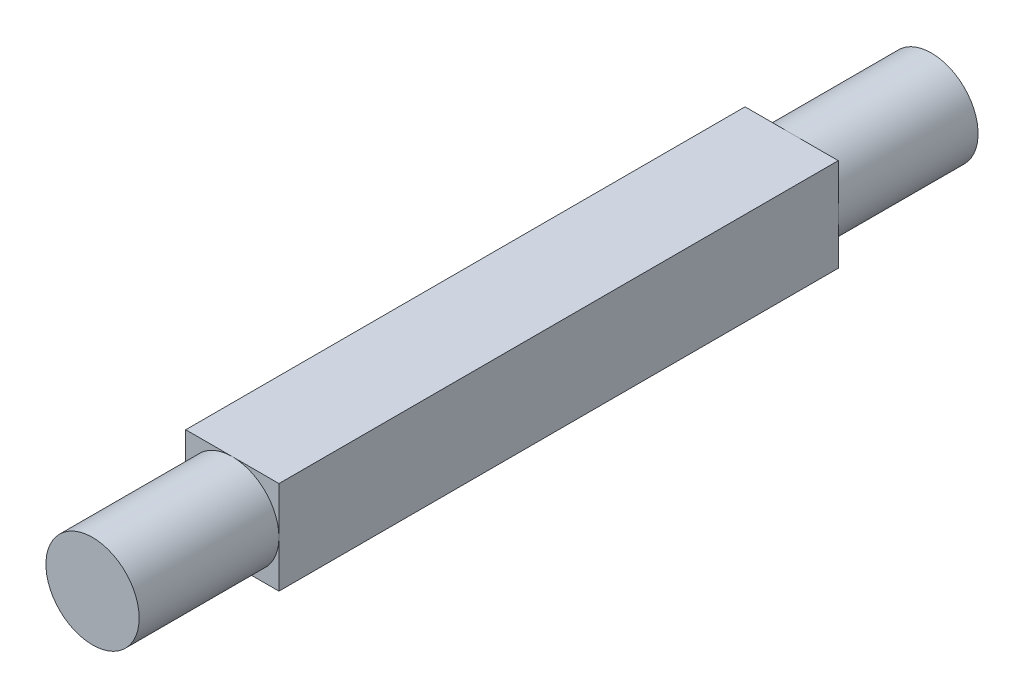
ISO-10303-21;
HEADER;
FILE_DESCRIPTION(('STEP AP214'),'2;1');
FILE_NAME('part.step','',(''),(''),'','','');
FILE_SCHEMA(('AUTOMOTIVE_DESIGN { 1 0 10303 214 1 1 1 1 }'));
ENDSEC;
DATA;
#1=APPLICATION_CONTEXT('core data for automotive mechanical design processes');
#2=APPLICATION_PROTOCOL_DEFINITION('international standard','automotive_design',2000,#1);
#3=PRODUCT_CONTEXT('',#1,'mechanical');
#4=PRODUCT('Part','Part','',(#3));
#5=PRODUCT_RELATED_PRODUCT_CATEGORY('part','',(#4));
#6=PRODUCT_DEFINITION_FORMATION('','',#4);
#7=PRODUCT_DEFINITION_CONTEXT('part definition',#1,'design');
#8=PRODUCT_DEFINITION('design','',#6,#7);
#9=PRODUCT_DEFINITION_SHAPE('','',#8);
#10=(LENGTH_UNIT() NAMED_UNIT(*) SI_UNIT(.MILLI.,.METRE.));
#11=(NAMED_UNIT(*) PLANE_ANGLE_UNIT() SI_UNIT($,.RADIAN.));
#12=(NAMED_UNIT(*) SI_UNIT($,.STERADIAN.) SOLID_ANGLE_UNIT());
#13=UNCERTAINTY_MEASURE_WITH_UNIT(LENGTH_MEASURE(1.E-05),#10,'distance_accuracy_value','');
#14=(GEOMETRIC_REPRESENTATION_CONTEXT(3) GLOBAL_UNCERTAINTY_ASSIGNED_CONTEXT((#13)) GLOBAL_UNIT_ASSIGNED_CONTEXT((#10,
#11,#12)) REPRESENTATION_CONTEXT('',''));
#15=CARTESIAN_POINT('',(0.,0.,0.));
#16=DIRECTION('',(0.,0.,1.));
#17=DIRECTION('',(1.,0.,0.));
#18=AXIS2_PLACEMENT_3D('',#15,#16,#17);
#19=CARTESIAN_POINT('',(0.,0.,0.));
#20=DIRECTION('',(0.,0.,1.));
#21=DIRECTION('',(1.,0.,0.));
#22=AXIS2_PLACEMENT_3D('',#19,#20,#21);
#23=PLANE('',#22);
#24=CARTESIAN_POINT('',(0.,0.,0.));
#25=DIRECTION('',(0.,0.,-1.));
#26=DIRECTION('',(-1.,0.,0.));
#27=AXIS2_PLACEMENT_3D('',#24,#25,#26);
#28=CIRCLE('',#27,1.);
#29=CARTESIAN_POINT('',(-1.,0.,0.));
#30=VERTEX_POINT('',#29);
#31=CARTESIAN_POINT('',(0.,1.,0.));
#32=VERTEX_POINT('',#31);
#33=EDGE_CURVE('E48',#30,#32,#28,.T.);
#34=ORIENTED_EDGE('',*,*,#33,.F.);
#35=DIRECTION('',(0.,-1.,0.));
#36=VECTOR('',#35,1.);
#37=CARTESIAN_POINT('',(-1.,-1.,0.));
#38=LINE('',#37,#36);
#39=CARTESIAN_POINT('',(-1.,1.,0.));
#40=VERTEX_POINT('',#39);
#41=EDGE_CURVE('E107',#40,#30,#38,.T.);
#42=ORIENTED_EDGE('',*,*,#41,.F.);
#43=DIRECTION('',(-1.,0.,0.));
#44=VECTOR('',#43,1.);
#45=CARTESIAN_POINT('',(1.,1.,0.));
#46=LINE('',#45,#44);
#47=EDGE_CURVE('E124',#32,#40,#46,.T.);
#48=ORIENTED_EDGE('',*,*,#47,.F.);
#49=EDGE_LOOP('',(#34,#42,#48));
#50=FACE_BOUND('',#49,.T.);
#51=ADVANCED_FACE('F37',(#50),#23,.F.);
#52=CARTESIAN_POINT('',(1.,0.,0.));
#53=VERTEX_POINT('',#52);
#54=EDGE_CURVE('E11',#32,#53,#28,.T.);
#55=ORIENTED_EDGE('',*,*,#54,.F.);
#56=CARTESIAN_POINT('',(1.,1.,0.));
#57=VERTEX_POINT('',#56);
#58=EDGE_CURVE('E160',#57,#32,#46,.T.);
#59=ORIENTED_EDGE('',*,*,#58,.F.);
#60=DIRECTION('',(0.,1.,0.));
#61=VECTOR('',#60,1.);
#62=CARTESIAN_POINT('',(1.,-1.,0.));
#63=LINE('',#62,#61);
#64=EDGE_CURVE('E156',#53,#57,#63,.T.);
#65=ORIENTED_EDGE('',*,*,#64,.F.);
#66=EDGE_LOOP('',(#55,#59,#65));
#67=FACE_BOUND('',#66,.T.);
#68=ADVANCED_FACE('F188',(#67),#23,.F.);
#69=CARTESIAN_POINT('',(0.,-1.,0.));
#70=VERTEX_POINT('',#69);
#71=EDGE_CURVE('E46',#53,#70,#28,.T.);
#72=ORIENTED_EDGE('',*,*,#71,.F.);
#73=CARTESIAN_POINT('',(1.,-1.,0.));
#74=VERTEX_POINT('',#73);
#75=EDGE_CURVE('E157',#74,#53,#63,.T.);
#76=ORIENTED_EDGE('',*,*,#75,.F.);
#77=DIRECTION('',(1.,0.,0.));
#78=VECTOR('',#77,1.);
#79=CARTESIAN_POINT('',(1.,-1.,0.));
#80=LINE('',#79,#78);
#81=EDGE_CURVE('E116',#70,#74,#80,.T.);
#82=ORIENTED_EDGE('',*,*,#81,.F.);
#83=EDGE_LOOP('',(#72,#76,#82));
#84=FACE_BOUND('',#83,.T.);
#85=ADVANCED_FACE('F190',(#84),#23,.F.);
#86=CARTESIAN_POINT('',(0.,0.,12.));
#87=DIRECTION('',(0.,0.,1.));
#88=DIRECTION('',(1.,0.,0.));
#89=AXIS2_PLACEMENT_3D('',#86,#87,#88);
#90=PLANE('',#89);
#91=CARTESIAN_POINT('',(0.,0.,12.));
#92=DIRECTION('',(0.,0.,1.));
#93=DIRECTION('',(1.,0.,0.));
#94=AXIS2_PLACEMENT_3D('',#91,#92,#93);
#95=CIRCLE('',#94,1.);
#96=CARTESIAN_POINT('',(1.,0.,12.));
#97=VERTEX_POINT('',#96);
#98=CARTESIAN_POINT('',(0.,1.,12.));
#99=VERTEX_POINT('',#98);
#100=EDGE_CURVE('E133',#97,#99,#95,.T.);
#101=ORIENTED_EDGE('',*,*,#100,.F.);
#102=DIRECTION('',(0.,1.,0.));
#103=VECTOR('',#102,1.);
#104=CARTESIAN_POINT('',(1.,-1.,12.));
#105=LINE('',#104,#103);
#106=CARTESIAN_POINT('',(1.,1.,12.));
#107=VERTEX_POINT('',#106);
#108=EDGE_CURVE('E148',#97,#107,#105,.T.);
#109=ORIENTED_EDGE('',*,*,#108,.T.);
#110=DIRECTION('',(-1.,0.,0.));
#111=VECTOR('',#110,1.);
#112=CARTESIAN_POINT('',(1.,1.,12.));
#113=LINE('',#112,#111);
#114=EDGE_CURVE('E152',#107,#99,#113,.T.);
#115=ORIENTED_EDGE('',*,*,#114,.T.);
#116=EDGE_LOOP('',(#101,#109,#115));
#117=FACE_BOUND('',#116,.T.);
#118=ADVANCED_FACE('F215',(#117),#90,.T.);
#119=CARTESIAN_POINT('',(-1.,0.,12.));
#120=VERTEX_POINT('',#119);
#121=EDGE_CURVE('E129',#99,#120,#95,.T.);
#122=ORIENTED_EDGE('',*,*,#121,.F.);
#123=CARTESIAN_POINT('',(-1.,1.,12.));
#124=VERTEX_POINT('',#123);
#125=EDGE_CURVE('E151',#99,#124,#113,.T.);
#126=ORIENTED_EDGE('',*,*,#125,.T.);
#127=DIRECTION('',(0.,-1.,0.));
#128=VECTOR('',#127,1.);
#129=CARTESIAN_POINT('',(-1.,-1.,12.));
#130=LINE('',#129,#128);
#131=EDGE_CURVE('E140',#124,#120,#130,.T.);
#132=ORIENTED_EDGE('',*,*,#131,.T.);
#133=EDGE_LOOP('',(#122,#126,#132));
#134=FACE_BOUND('',#133,.T.);
#135=ADVANCED_FACE('F180',(#134),#90,.T.);
#136=CARTESIAN_POINT('',(0.,-1.,12.));
#137=VERTEX_POINT('',#136);
#138=EDGE_CURVE('E131',#120,#137,#95,.T.);
#139=ORIENTED_EDGE('',*,*,#138,.F.);
#140=CARTESIAN_POINT('',(-1.,-1.,12.));
#141=VERTEX_POINT('',#140);
#142=EDGE_CURVE('E144',#120,#141,#130,.T.);
#143=ORIENTED_EDGE('',*,*,#142,.T.);
#144=DIRECTION('',(1.,0.,0.));
#145=VECTOR('',#144,1.);
#146=CARTESIAN_POINT('',(1.,-1.,12.));
#147=LINE('',#146,#145);
#148=EDGE_CURVE('E145',#141,#137,#147,.T.);
#149=ORIENTED_EDGE('',*,*,#148,.T.);
#150=EDGE_LOOP('',(#139,#143,#149));
#151=FACE_BOUND('',#150,.T.);
#152=ADVANCED_FACE('F178',(#151),#90,.T.);
#153=CARTESIAN_POINT('',(-1.,-1.,12.));
#154=DIRECTION('',(1.,0.,0.));
#155=DIRECTION('',(0.,0.,-1.));
#156=AXIS2_PLACEMENT_3D('',#153,#154,#155);
#157=PLANE('',#156);
#158=ORIENTED_EDGE('',*,*,#41,.T.);
#159=CARTESIAN_POINT('',(-1.,-1.,0.));
#160=VERTEX_POINT('',#159);
#161=EDGE_CURVE('E109',#30,#160,#38,.T.);
#162=ORIENTED_EDGE('',*,*,#161,.T.);
#163=DIRECTION('',(0.,0.,-1.));
#164=VECTOR('',#163,1.);
#165=CARTESIAN_POINT('',(-1.,-1.,12.));
#166=LINE('',#165,#164);
#167=EDGE_CURVE('E41',#141,#160,#166,.T.);
#168=ORIENTED_EDGE('',*,*,#167,.F.);
#169=ORIENTED_EDGE('',*,*,#142,.F.);
#170=ORIENTED_EDGE('',*,*,#131,.F.);
#171=DIRECTION('',(0.,0.,-1.));
#172=VECTOR('',#171,1.);
#173=CARTESIAN_POINT('',(-1.,1.,12.));
#174=LINE('',#173,#172);
#175=EDGE_CURVE('E112',#124,#40,#174,.T.);
#176=ORIENTED_EDGE('',*,*,#175,.T.);
#177=EDGE_LOOP('',(#158,#162,#168,#169,#170,#176));
#178=FACE_BOUND('',#177,.T.);
#179=ADVANCED_FACE('F39',(#178),#157,.F.);
#180=CARTESIAN_POINT('',(1.,-1.,12.));
#181=DIRECTION('',(0.,1.,0.));
#182=DIRECTION('',(-1.,0.,0.));
#183=AXIS2_PLACEMENT_3D('',#180,#181,#182);
#184=PLANE('',#183);
#185=EDGE_CURVE('E120',#160,#70,#80,.T.);
#186=ORIENTED_EDGE('',*,*,#185,.T.);
#187=ORIENTED_EDGE('',*,*,#81,.T.);
#188=DIRECTION('',(0.,0.,-1.));
#189=VECTOR('',#188,1.);
#190=CARTESIAN_POINT('',(1.,-1.,12.));
#191=LINE('',#190,#189);
#192=CARTESIAN_POINT('',(1.,-1.,12.));
#193=VERTEX_POINT('',#192);
#194=EDGE_CURVE('E165',#193,#74,#191,.T.);
#195=ORIENTED_EDGE('',*,*,#194,.F.);
#196=EDGE_CURVE('E143',#137,#193,#147,.T.);
#197=ORIENTED_EDGE('',*,*,#196,.F.);
#198=ORIENTED_EDGE('',*,*,#148,.F.);
#199=ORIENTED_EDGE('',*,*,#167,.T.);
#200=EDGE_LOOP('',(#186,#187,#195,#197,#198,#199));
#201=FACE_BOUND('',#200,.T.);
#202=ADVANCED_FACE('F191',(#201),#184,.F.);
#203=CARTESIAN_POINT('',(1.,-1.,12.));
#204=DIRECTION('',(-1.,0.,0.));
#205=DIRECTION('',(0.,0.,1.));
#206=AXIS2_PLACEMENT_3D('',#203,#204,#205);
#207=PLANE('',#206);
#208=ORIENTED_EDGE('',*,*,#75,.T.);
#209=ORIENTED_EDGE('',*,*,#64,.T.);
#210=DIRECTION('',(0.,0.,-1.));
#211=VECTOR('',#210,1.);
#212=CARTESIAN_POINT('',(1.,1.,12.));
#213=LINE('',#212,#211);
#214=EDGE_CURVE('E163',#107,#57,#213,.T.);
#215=ORIENTED_EDGE('',*,*,#214,.F.);
#216=ORIENTED_EDGE('',*,*,#108,.F.);
#217=EDGE_CURVE('E149',#193,#97,#105,.T.);
#218=ORIENTED_EDGE('',*,*,#217,.F.);
#219=ORIENTED_EDGE('',*,*,#194,.T.);
#220=EDGE_LOOP('',(#208,#209,#215,#216,#218,#219));
#221=FACE_BOUND('',#220,.T.);
#222=ADVANCED_FACE('F189',(#221),#207,.F.);
#223=CARTESIAN_POINT('',(1.,1.,12.));
#224=DIRECTION('',(0.,-1.,0.));
#225=DIRECTION('',(1.,0.,0.));
#226=AXIS2_PLACEMENT_3D('',#223,#224,#225);
#227=PLANE('',#226);
#228=ORIENTED_EDGE('',*,*,#58,.T.);
#229=ORIENTED_EDGE('',*,*,#47,.T.);
#230=ORIENTED_EDGE('',*,*,#175,.F.);
#231=ORIENTED_EDGE('',*,*,#125,.F.);
#232=ORIENTED_EDGE('',*,*,#114,.F.);
#233=ORIENTED_EDGE('',*,*,#214,.T.);
#234=EDGE_LOOP('',(#228,#229,#230,#231,#232,#233));
#235=FACE_BOUND('',#234,.T.);
#236=ADVANCED_FACE('F184',(#235),#227,.F.);
#237=EDGE_CURVE('E139',#137,#97,#95,.T.);
#238=ORIENTED_EDGE('',*,*,#237,.F.);
#239=ORIENTED_EDGE('',*,*,#196,.T.);
#240=ORIENTED_EDGE('',*,*,#217,.T.);
#241=EDGE_LOOP('',(#238,#239,#240));
#242=FACE_BOUND('',#241,.T.);
#243=ADVANCED_FACE('F206',(#242),#90,.T.);
#244=EDGE_CURVE('E55',#70,#30,#28,.T.);
#245=ORIENTED_EDGE('',*,*,#244,.F.);
#246=ORIENTED_EDGE('',*,*,#185,.F.);
#247=ORIENTED_EDGE('',*,*,#161,.F.);
#248=EDGE_LOOP('',(#245,#246,#247));
#249=FACE_BOUND('',#248,.T.);
#250=ADVANCED_FACE('F118',(#249),#23,.F.);
#251=CARTESIAN_POINT('',(0.,0.,15.));
#252=DIRECTION('',(0.,0.,-1.));
#253=DIRECTION('',(-1.,0.,0.));
#254=AXIS2_PLACEMENT_3D('',#251,#252,#253);
#255=CYLINDRICAL_SURFACE('',#254,1.);
#256=CARTESIAN_POINT('',(0.,0.,15.));
#257=DIRECTION('',(0.,0.,1.));
#258=DIRECTION('',(1.,0.,0.));
#259=AXIS2_PLACEMENT_3D('',#256,#257,#258);
#260=CIRCLE('',#259,1.);
#261=CARTESIAN_POINT('',(1.,0.,15.));
#262=VERTEX_POINT('',#261);
#263=EDGE_CURVE('E122',#262,#262,#260,.T.);
#264=ORIENTED_EDGE('',*,*,#263,.F.);
#265=EDGE_LOOP('',(#264));
#266=FACE_BOUND('',#265,.T.);
#267=ORIENTED_EDGE('',*,*,#100,.T.);
#268=ORIENTED_EDGE('',*,*,#121,.T.);
#269=ORIENTED_EDGE('',*,*,#138,.T.);
#270=ORIENTED_EDGE('',*,*,#237,.T.);
#271=EDGE_LOOP('',(#267,#268,#269,#270));
#272=FACE_BOUND('',#271,.T.);
#273=ADVANCED_FACE('F175',(#266,#272),#255,.T.);
#274=CARTESIAN_POINT('',(0.,0.,15.));
#275=DIRECTION('',(0.,0.,1.));
#276=DIRECTION('',(1.,0.,0.));
#277=AXIS2_PLACEMENT_3D('',#274,#275,#276);
#278=PLANE('',#277);
#279=ORIENTED_EDGE('',*,*,#263,.T.);
#280=EDGE_LOOP('',(#279));
#281=FACE_BOUND('',#280,.T.);
#282=ADVANCED_FACE('F211',(#281),#278,.T.);
#283=CARTESIAN_POINT('',(0.,0.,-3.));
#284=DIRECTION('',(0.,0.,1.));
#285=DIRECTION('',(1.,0.,0.));
#286=AXIS2_PLACEMENT_3D('',#283,#284,#285);
#287=CYLINDRICAL_SURFACE('',#286,1.);
#288=CARTESIAN_POINT('',(0.,0.,-3.));
#289=DIRECTION('',(0.,0.,-1.));
#290=DIRECTION('',(-1.,0.,0.));
#291=AXIS2_PLACEMENT_3D('',#288,#289,#290);
#292=CIRCLE('',#291,1.);
#293=CARTESIAN_POINT('',(-1.,0.,-3.));
#294=VERTEX_POINT('',#293);
#295=EDGE_CURVE('E127',#294,#294,#292,.T.);
#296=ORIENTED_EDGE('',*,*,#295,.F.);
#297=EDGE_LOOP('',(#296));
#298=FACE_BOUND('',#297,.T.);
#299=ORIENTED_EDGE('',*,*,#33,.T.);
#300=ORIENTED_EDGE('',*,*,#54,.T.);
#301=ORIENTED_EDGE('',*,*,#71,.T.);
#302=ORIENTED_EDGE('',*,*,#244,.T.);
#303=EDGE_LOOP('',(#299,#300,#301,#302));
#304=FACE_BOUND('',#303,.T.);
#305=ADVANCED_FACE('F128',(#298,#304),#287,.T.);
#306=CARTESIAN_POINT('',(0.,0.,-3.));
#307=DIRECTION('',(0.,0.,-1.));
#308=DIRECTION('',(-1.,0.,0.));
#309=AXIS2_PLACEMENT_3D('',#306,#307,#308);
#310=PLANE('',#309);
#311=ORIENTED_EDGE('',*,*,#295,.T.);
#312=EDGE_LOOP('',(#311));
#313=FACE_BOUND('',#312,.T.);
#314=ADVANCED_FACE('F231',(#313),#310,.T.);
#315=CLOSED_SHELL('',(#51,#68,#85,#118,#135,#152,#179,#202,#222,#236,#243,#250,#273,#282,#305,#314));
#316=MANIFOLD_SOLID_BREP('B2',#315);
#317=ADVANCED_BREP_SHAPE_REPRESENTATION('',(#18,#316),#14);
#318=SHAPE_DEFINITION_REPRESENTATION(#9,#317);
ENDSEC;
END-ISO-10303-21;
